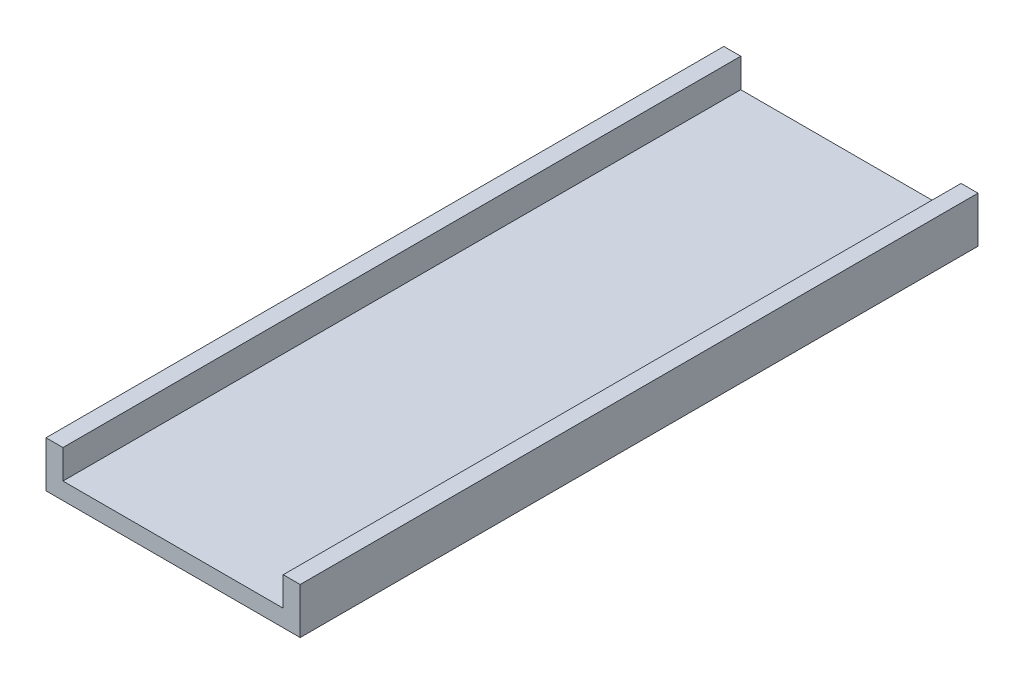
ISO-10303-21;
HEADER;
FILE_DESCRIPTION(('STEP AP214'),'2;1');
FILE_NAME('part.step','',(''),(''),'','','');
FILE_SCHEMA(('AUTOMOTIVE_DESIGN { 1 0 10303 214 1 1 1 1 }'));
ENDSEC;
DATA;
#1=APPLICATION_CONTEXT('core data for automotive mechanical design processes');
#2=APPLICATION_PROTOCOL_DEFINITION('international standard','automotive_design',2000,#1);
#3=PRODUCT_CONTEXT('',#1,'mechanical');
#4=PRODUCT('Part','Part','',(#3));
#5=PRODUCT_RELATED_PRODUCT_CATEGORY('part','',(#4));
#6=PRODUCT_DEFINITION_FORMATION('','',#4);
#7=PRODUCT_DEFINITION_CONTEXT('part definition',#1,'design');
#8=PRODUCT_DEFINITION('design','',#6,#7);
#9=PRODUCT_DEFINITION_SHAPE('','',#8);
#10=(LENGTH_UNIT() NAMED_UNIT(*) SI_UNIT(.MILLI.,.METRE.));
#11=(NAMED_UNIT(*) PLANE_ANGLE_UNIT() SI_UNIT($,.RADIAN.));
#12=(NAMED_UNIT(*) SI_UNIT($,.STERADIAN.) SOLID_ANGLE_UNIT());
#13=UNCERTAINTY_MEASURE_WITH_UNIT(LENGTH_MEASURE(1.E-05),#10,'distance_accuracy_value','');
#14=(GEOMETRIC_REPRESENTATION_CONTEXT(3) GLOBAL_UNCERTAINTY_ASSIGNED_CONTEXT((#13)) GLOBAL_UNIT_ASSIGNED_CONTEXT((#10,
#11,#12)) REPRESENTATION_CONTEXT('',''));
#15=CARTESIAN_POINT('',(0.,0.,0.));
#16=DIRECTION('',(0.,0.,1.));
#17=DIRECTION('',(1.,0.,0.));
#18=AXIS2_PLACEMENT_3D('',#15,#16,#17);
#19=CARTESIAN_POINT('',(-25.2586844625503,5.42556325823224,95.));
#20=DIRECTION('',(0.,-1.,0.));
#21=DIRECTION('',(0.,0.,-1.));
#22=AXIS2_PLACEMENT_3D('',#19,#20,#21);
#23=PLANE('',#22);
#24=DIRECTION('',(0.,0.,-1.));
#25=VECTOR('',#24,1.);
#26=CARTESIAN_POINT('',(-27.2586844625503,5.42556325823224,95.));
#27=LINE('',#26,#25);
#28=CARTESIAN_POINT('',(-27.2586844625503,5.42556325823224,80.));
#29=VERTEX_POINT('',#28);
#30=CARTESIAN_POINT('',(-27.2586844625503,5.42556325823224,0.));
#31=VERTEX_POINT('',#30);
#32=EDGE_CURVE('E47',#29,#31,#27,.T.);
#33=ORIENTED_EDGE('',*,*,#32,.F.);
#34=DIRECTION('',(1.,0.,0.));
#35=VECTOR('',#34,1.);
#36=CARTESIAN_POINT('',(-43.2586844625503,5.42556325823224,80.));
#37=LINE('',#36,#35);
#38=CARTESIAN_POINT('',(-25.2586844625503,5.42556325823224,80.));
#39=VERTEX_POINT('',#38);
#40=EDGE_CURVE('E201',#29,#39,#37,.T.);
#41=ORIENTED_EDGE('',*,*,#40,.T.);
#42=DIRECTION('',(0.,0.,-1.));
#43=VECTOR('',#42,1.);
#44=CARTESIAN_POINT('',(-25.2586844625503,5.42556325823224,95.));
#45=LINE('',#44,#43);
#46=CARTESIAN_POINT('',(-25.2586844625503,5.42556325823224,0.));
#47=VERTEX_POINT('',#46);
#48=EDGE_CURVE('E61',#39,#47,#45,.T.);
#49=ORIENTED_EDGE('',*,*,#48,.T.);
#50=DIRECTION('',(-1.,0.,0.));
#51=VECTOR('',#50,1.);
#52=CARTESIAN_POINT('',(-25.2586844625503,5.42556325823224,0.));
#53=LINE('',#52,#51);
#54=EDGE_CURVE('E149',#47,#31,#53,.T.);
#55=ORIENTED_EDGE('',*,*,#54,.T.);
#56=EDGE_LOOP('',(#33,#41,#49,#55));
#57=FACE_BOUND('',#56,.T.);
#58=ADVANCED_FACE('F39',(#57),#23,.F.);
#59=CARTESIAN_POINT('',(-27.2586844625503,5.42556325823224,95.));
#60=DIRECTION('',(1.,0.,0.));
#61=DIRECTION('',(0.,0.,-1.));
#62=AXIS2_PLACEMENT_3D('',#59,#60,#61);
#63=PLANE('',#62);
#64=DIRECTION('',(0.,0.,-1.));
#65=VECTOR('',#64,1.);
#66=CARTESIAN_POINT('',(-27.2586844625503,0.,95.));
#67=LINE('',#66,#65);
#68=CARTESIAN_POINT('',(-27.2586844625503,0.,80.));
#69=VERTEX_POINT('',#68);
#70=CARTESIAN_POINT('',(-27.2586844625503,0.,0.));
#71=VERTEX_POINT('',#70);
#72=EDGE_CURVE('E130',#69,#71,#67,.T.);
#73=ORIENTED_EDGE('',*,*,#72,.F.);
#74=DIRECTION('',(0.,1.,0.));
#75=VECTOR('',#74,1.);
#76=CARTESIAN_POINT('',(-27.2586844625503,5.42556325823224,80.));
#77=LINE('',#76,#75);
#78=EDGE_CURVE('E109',#69,#29,#77,.T.);
#79=ORIENTED_EDGE('',*,*,#78,.T.);
#80=ORIENTED_EDGE('',*,*,#32,.T.);
#81=DIRECTION('',(0.,-1.,0.));
#82=VECTOR('',#81,1.);
#83=CARTESIAN_POINT('',(-27.2586844625503,5.42556325823224,0.));
#84=LINE('',#83,#82);
#85=EDGE_CURVE('E144',#31,#71,#84,.T.);
#86=ORIENTED_EDGE('',*,*,#85,.T.);
#87=EDGE_LOOP('',(#73,#79,#80,#86));
#88=FACE_BOUND('',#87,.T.);
#89=ADVANCED_FACE('F143',(#88),#63,.F.);
#90=CARTESIAN_POINT('',(-27.2586844625503,0.,95.));
#91=DIRECTION('',(0.,1.,0.));
#92=DIRECTION('',(0.,0.,1.));
#93=AXIS2_PLACEMENT_3D('',#90,#91,#92);
#94=PLANE('',#93);
#95=DIRECTION('',(0.,0.,-1.));
#96=VECTOR('',#95,1.);
#97=CARTESIAN_POINT('',(2.74131553744975,0.,95.));
#98=LINE('',#97,#96);
#99=CARTESIAN_POINT('',(2.74131553744975,0.,80.));
#100=VERTEX_POINT('',#99);
#101=CARTESIAN_POINT('',(2.74131553744975,0.,0.));
#102=VERTEX_POINT('',#101);
#103=EDGE_CURVE('E120',#100,#102,#98,.T.);
#104=ORIENTED_EDGE('',*,*,#103,.F.);
#105=DIRECTION('',(1.,0.,0.));
#106=VECTOR('',#105,1.);
#107=CARTESIAN_POINT('',(-43.2586844625503,0.,80.));
#108=LINE('',#107,#106);
#109=EDGE_CURVE('E103',#69,#100,#108,.T.);
#110=ORIENTED_EDGE('',*,*,#109,.F.);
#111=ORIENTED_EDGE('',*,*,#72,.T.);
#112=DIRECTION('',(1.,0.,0.));
#113=VECTOR('',#112,1.);
#114=CARTESIAN_POINT('',(-27.2586844625503,0.,0.));
#115=LINE('',#114,#113);
#116=EDGE_CURVE('E127',#71,#102,#115,.T.);
#117=ORIENTED_EDGE('',*,*,#116,.T.);
#118=EDGE_LOOP('',(#104,#110,#111,#117));
#119=FACE_BOUND('',#118,.T.);
#120=ADVANCED_FACE('F125',(#119),#94,.F.);
#121=CARTESIAN_POINT('',(2.74131553744975,0.,95.));
#122=DIRECTION('',(-1.,0.,0.));
#123=DIRECTION('',(0.,0.,1.));
#124=AXIS2_PLACEMENT_3D('',#121,#122,#123);
#125=PLANE('',#124);
#126=DIRECTION('',(0.,0.,-1.));
#127=VECTOR('',#126,1.);
#128=CARTESIAN_POINT('',(2.74131553744975,5.42556325823224,95.));
#129=LINE('',#128,#127);
#130=CARTESIAN_POINT('',(2.74131553744975,5.42556325823224,80.));
#131=VERTEX_POINT('',#130);
#132=CARTESIAN_POINT('',(2.74131553744975,5.42556325823224,0.));
#133=VERTEX_POINT('',#132);
#134=EDGE_CURVE('E122',#131,#133,#129,.T.);
#135=ORIENTED_EDGE('',*,*,#134,.F.);
#136=DIRECTION('',(0.,1.,0.));
#137=VECTOR('',#136,1.);
#138=CARTESIAN_POINT('',(2.74131553744975,0.,80.));
#139=LINE('',#138,#137);
#140=EDGE_CURVE('E106',#100,#131,#139,.T.);
#141=ORIENTED_EDGE('',*,*,#140,.F.);
#142=ORIENTED_EDGE('',*,*,#103,.T.);
#143=DIRECTION('',(0.,1.,0.));
#144=VECTOR('',#143,1.);
#145=CARTESIAN_POINT('',(2.74131553744975,0.,0.));
#146=LINE('',#145,#144);
#147=EDGE_CURVE('E161',#102,#133,#146,.T.);
#148=ORIENTED_EDGE('',*,*,#147,.T.);
#149=EDGE_LOOP('',(#135,#141,#142,#148));
#150=FACE_BOUND('',#149,.T.);
#151=ADVANCED_FACE('F118',(#150),#125,.F.);
#152=CARTESIAN_POINT('',(2.74131553744975,5.42556325823224,95.));
#153=DIRECTION('',(0.,-1.,0.));
#154=DIRECTION('',(0.,0.,-1.));
#155=AXIS2_PLACEMENT_3D('',#152,#153,#154);
#156=PLANE('',#155);
#157=DIRECTION('',(0.,0.,-1.));
#158=VECTOR('',#157,1.);
#159=CARTESIAN_POINT('',(0.741315537449746,5.42556325823224,95.));
#160=LINE('',#159,#158);
#161=CARTESIAN_POINT('',(0.741315537449744,5.42556325823224,80.));
#162=VERTEX_POINT('',#161);
#163=CARTESIAN_POINT('',(0.741315537449746,5.42556325823224,0.));
#164=VERTEX_POINT('',#163);
#165=EDGE_CURVE('E135',#162,#164,#160,.T.);
#166=ORIENTED_EDGE('',*,*,#165,.F.);
#167=EDGE_CURVE('E114',#162,#131,#37,.T.);
#168=ORIENTED_EDGE('',*,*,#167,.T.);
#169=ORIENTED_EDGE('',*,*,#134,.T.);
#170=DIRECTION('',(-1.,0.,0.));
#171=VECTOR('',#170,1.);
#172=CARTESIAN_POINT('',(2.74131553744975,5.42556325823224,0.));
#173=LINE('',#172,#171);
#174=EDGE_CURVE('E164',#133,#164,#173,.T.);
#175=ORIENTED_EDGE('',*,*,#174,.T.);
#176=EDGE_LOOP('',(#166,#168,#169,#175));
#177=FACE_BOUND('',#176,.T.);
#178=ADVANCED_FACE('F196',(#177),#156,.F.);
#179=CARTESIAN_POINT('',(0.741315537449746,2.,95.));
#180=DIRECTION('',(1.,0.,0.));
#181=DIRECTION('',(0.,0.,-1.));
#182=AXIS2_PLACEMENT_3D('',#179,#180,#181);
#183=PLANE('',#182);
#184=DIRECTION('',(0.,0.,-1.));
#185=VECTOR('',#184,1.);
#186=CARTESIAN_POINT('',(0.741315537449746,2.,95.));
#187=LINE('',#186,#185);
#188=CARTESIAN_POINT('',(0.741315537449744,2.,80.));
#189=VERTEX_POINT('',#188);
#190=CARTESIAN_POINT('',(0.741315537449746,2.,0.));
#191=VERTEX_POINT('',#190);
#192=EDGE_CURVE('E184',#189,#191,#187,.T.);
#193=ORIENTED_EDGE('',*,*,#192,.F.);
#194=DIRECTION('',(0.,1.,0.));
#195=VECTOR('',#194,1.);
#196=CARTESIAN_POINT('',(0.741315537449746,2.,80.));
#197=LINE('',#196,#195);
#198=EDGE_CURVE('E155',#189,#162,#197,.T.);
#199=ORIENTED_EDGE('',*,*,#198,.T.);
#200=ORIENTED_EDGE('',*,*,#165,.T.);
#201=DIRECTION('',(0.,-1.,0.));
#202=VECTOR('',#201,1.);
#203=CARTESIAN_POINT('',(0.741315537449746,2.,0.));
#204=LINE('',#203,#202);
#205=EDGE_CURVE('E168',#164,#191,#204,.T.);
#206=ORIENTED_EDGE('',*,*,#205,.T.);
#207=EDGE_LOOP('',(#193,#199,#200,#206));
#208=FACE_BOUND('',#207,.T.);
#209=ADVANCED_FACE('F191',(#208),#183,.F.);
#210=CARTESIAN_POINT('',(-25.2586844625503,2.,95.));
#211=DIRECTION('',(0.,-1.,0.));
#212=DIRECTION('',(0.,0.,-1.));
#213=AXIS2_PLACEMENT_3D('',#210,#211,#212);
#214=PLANE('',#213);
#215=DIRECTION('',(0.,0.,-1.));
#216=VECTOR('',#215,1.);
#217=CARTESIAN_POINT('',(-25.2586844625503,2.,95.));
#218=LINE('',#217,#216);
#219=CARTESIAN_POINT('',(-25.2586844625503,2.,80.));
#220=VERTEX_POINT('',#219);
#221=CARTESIAN_POINT('',(-25.2586844625503,2.,0.));
#222=VERTEX_POINT('',#221);
#223=EDGE_CURVE('E181',#220,#222,#218,.T.);
#224=ORIENTED_EDGE('',*,*,#223,.F.);
#225=DIRECTION('',(1.,0.,0.));
#226=VECTOR('',#225,1.);
#227=CARTESIAN_POINT('',(-25.2586844625503,2.,80.));
#228=LINE('',#227,#226);
#229=EDGE_CURVE('E54',#220,#189,#228,.T.);
#230=ORIENTED_EDGE('',*,*,#229,.T.);
#231=ORIENTED_EDGE('',*,*,#192,.T.);
#232=DIRECTION('',(-1.,0.,0.));
#233=VECTOR('',#232,1.);
#234=CARTESIAN_POINT('',(-25.2586844625503,2.,0.));
#235=LINE('',#234,#233);
#236=EDGE_CURVE('E172',#191,#222,#235,.T.);
#237=ORIENTED_EDGE('',*,*,#236,.T.);
#238=EDGE_LOOP('',(#224,#230,#231,#237));
#239=FACE_BOUND('',#238,.T.);
#240=ADVANCED_FACE('F199',(#239),#214,.F.);
#241=CARTESIAN_POINT('',(-25.2586844625503,5.42556325823224,95.));
#242=DIRECTION('',(-1.,0.,0.));
#243=DIRECTION('',(0.,0.,1.));
#244=AXIS2_PLACEMENT_3D('',#241,#242,#243);
#245=PLANE('',#244);
#246=ORIENTED_EDGE('',*,*,#48,.F.);
#247=DIRECTION('',(0.,-1.,0.));
#248=VECTOR('',#247,1.);
#249=CARTESIAN_POINT('',(-25.2586844625503,5.42556325823224,80.));
#250=LINE('',#249,#248);
#251=EDGE_CURVE('E11',#39,#220,#250,.T.);
#252=ORIENTED_EDGE('',*,*,#251,.T.);
#253=ORIENTED_EDGE('',*,*,#223,.T.);
#254=DIRECTION('',(0.,1.,0.));
#255=VECTOR('',#254,1.);
#256=CARTESIAN_POINT('',(-25.2586844625503,5.42556325823224,0.));
#257=LINE('',#256,#255);
#258=EDGE_CURVE('E176',#222,#47,#257,.T.);
#259=ORIENTED_EDGE('',*,*,#258,.T.);
#260=EDGE_LOOP('',(#246,#252,#253,#259));
#261=FACE_BOUND('',#260,.T.);
#262=ADVANCED_FACE('F208',(#261),#245,.F.);
#263=CARTESIAN_POINT('',(0.,0.,0.));
#264=DIRECTION('',(0.,0.,1.));
#265=DIRECTION('',(1.,0.,0.));
#266=AXIS2_PLACEMENT_3D('',#263,#264,#265);
#267=PLANE('',#266);
#268=ORIENTED_EDGE('',*,*,#54,.F.);
#269=ORIENTED_EDGE('',*,*,#258,.F.);
#270=ORIENTED_EDGE('',*,*,#236,.F.);
#271=ORIENTED_EDGE('',*,*,#205,.F.);
#272=ORIENTED_EDGE('',*,*,#174,.F.);
#273=ORIENTED_EDGE('',*,*,#147,.F.);
#274=ORIENTED_EDGE('',*,*,#116,.F.);
#275=ORIENTED_EDGE('',*,*,#85,.F.);
#276=EDGE_LOOP('',(#268,#269,#270,#271,#272,#273,#274,#275));
#277=FACE_BOUND('',#276,.T.);
#278=ADVANCED_FACE('F147',(#277),#267,.F.);
#279=CARTESIAN_POINT('',(-43.2586844625503,0.,80.));
#280=DIRECTION('',(0.,0.,-1.));
#281=DIRECTION('',(-1.,0.,0.));
#282=AXIS2_PLACEMENT_3D('',#279,#280,#281);
#283=PLANE('',#282);
#284=ORIENTED_EDGE('',*,*,#109,.T.);
#285=ORIENTED_EDGE('',*,*,#140,.T.);
#286=ORIENTED_EDGE('',*,*,#167,.F.);
#287=ORIENTED_EDGE('',*,*,#198,.F.);
#288=ORIENTED_EDGE('',*,*,#229,.F.);
#289=ORIENTED_EDGE('',*,*,#251,.F.);
#290=ORIENTED_EDGE('',*,*,#40,.F.);
#291=ORIENTED_EDGE('',*,*,#78,.F.);
#292=EDGE_LOOP('',(#284,#285,#286,#287,#288,#289,#290,#291));
#293=FACE_BOUND('',#292,.T.);
#294=ADVANCED_FACE('F105',(#293),#283,.F.);
#295=CLOSED_SHELL('',(#58,#89,#120,#151,#178,#209,#240,#262,#278,#294));
#296=MANIFOLD_SOLID_BREP('B2',#295);
#297=ADVANCED_BREP_SHAPE_REPRESENTATION('',(#18,#296),#14);
#298=SHAPE_DEFINITION_REPRESENTATION(#9,#297);
ENDSEC;
END-ISO-10303-21;
